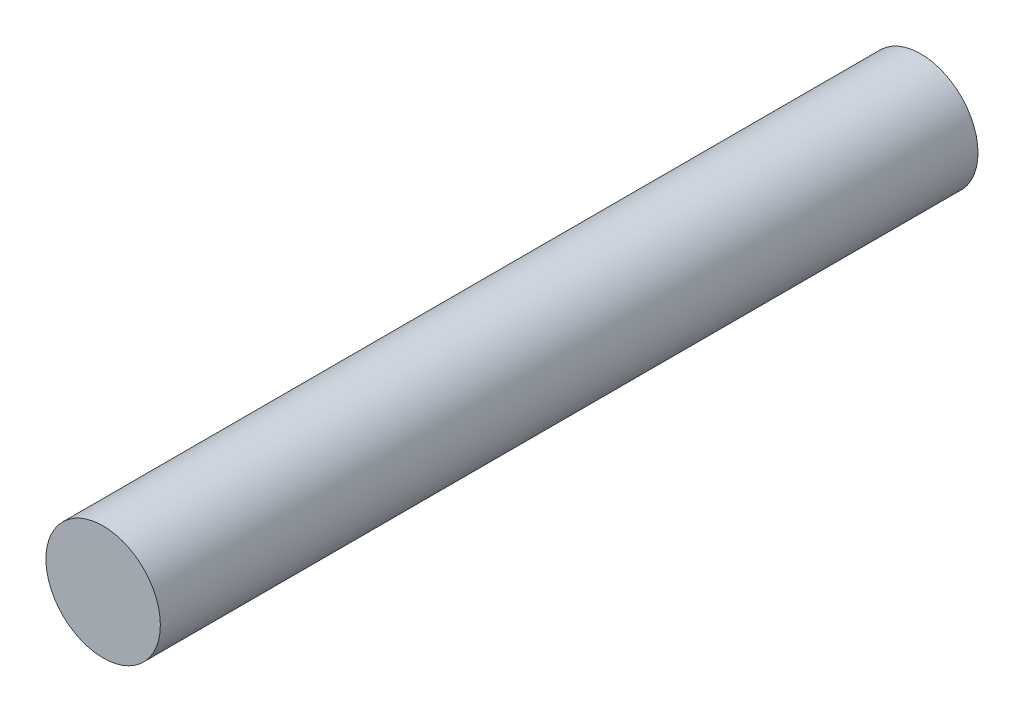
ISO-10303-21;
HEADER;
FILE_DESCRIPTION(('STEP AP214'),'2;1');
FILE_NAME('part.step','',(''),(''),'','','');
FILE_SCHEMA(('AUTOMOTIVE_DESIGN { 1 0 10303 214 1 1 1 1 }'));
ENDSEC;
DATA;
#1=APPLICATION_CONTEXT('core data for automotive mechanical design processes');
#2=APPLICATION_PROTOCOL_DEFINITION('international standard','automotive_design',2000,#1);
#3=PRODUCT_CONTEXT('',#1,'mechanical');
#4=PRODUCT('Part','Part','',(#3));
#5=PRODUCT_RELATED_PRODUCT_CATEGORY('part','',(#4));
#6=PRODUCT_DEFINITION_FORMATION('','',#4);
#7=PRODUCT_DEFINITION_CONTEXT('part definition',#1,'design');
#8=PRODUCT_DEFINITION('design','',#6,#7);
#9=PRODUCT_DEFINITION_SHAPE('','',#8);
#10=(LENGTH_UNIT() NAMED_UNIT(*) SI_UNIT(.MILLI.,.METRE.));
#11=(NAMED_UNIT(*) PLANE_ANGLE_UNIT() SI_UNIT($,.RADIAN.));
#12=(NAMED_UNIT(*) SI_UNIT($,.STERADIAN.) SOLID_ANGLE_UNIT());
#13=UNCERTAINTY_MEASURE_WITH_UNIT(LENGTH_MEASURE(1.E-05),#10,'distance_accuracy_value','');
#14=(GEOMETRIC_REPRESENTATION_CONTEXT(3) GLOBAL_UNCERTAINTY_ASSIGNED_CONTEXT((#13)) GLOBAL_UNIT_ASSIGNED_CONTEXT((#10,
#11,#12)) REPRESENTATION_CONTEXT('',''));
#15=CARTESIAN_POINT('',(0.,0.,0.));
#16=DIRECTION('',(0.,0.,1.));
#17=DIRECTION('',(1.,0.,0.));
#18=AXIS2_PLACEMENT_3D('',#15,#16,#17);
#19=CARTESIAN_POINT('',(0.,0.,100.));
#20=DIRECTION('',(0.,0.,-1.));
#21=DIRECTION('',(-1.,0.,0.));
#22=AXIS2_PLACEMENT_3D('',#19,#20,#21);
#23=CYLINDRICAL_SURFACE('',#22,7.);
#24=CARTESIAN_POINT('',(0.,0.,100.));
#25=DIRECTION('',(0.,0.,1.));
#26=DIRECTION('',(1.,0.,0.));
#27=AXIS2_PLACEMENT_3D('',#24,#25,#26);
#28=CIRCLE('',#27,7.);
#29=CARTESIAN_POINT('',(7.,0.,100.));
#30=VERTEX_POINT('',#29);
#31=EDGE_CURVE('E10',#30,#30,#28,.T.);
#32=ORIENTED_EDGE('',*,*,#31,.F.);
#33=EDGE_LOOP('',(#32));
#34=FACE_BOUND('',#33,.T.);
#35=CARTESIAN_POINT('',(0.,0.,0.));
#36=DIRECTION('',(0.,0.,1.));
#37=DIRECTION('',(1.,0.,0.));
#38=AXIS2_PLACEMENT_3D('',#35,#36,#37);
#39=CIRCLE('',#38,7.);
#40=CARTESIAN_POINT('',(7.,0.,0.));
#41=VERTEX_POINT('',#40);
#42=EDGE_CURVE('E40',#41,#41,#39,.T.);
#43=ORIENTED_EDGE('',*,*,#42,.T.);
#44=EDGE_LOOP('',(#43));
#45=FACE_BOUND('',#44,.T.);
#46=ADVANCED_FACE('F37',(#34,#45),#23,.T.);
#47=CARTESIAN_POINT('',(0.,0.,100.));
#48=DIRECTION('',(0.,0.,1.));
#49=DIRECTION('',(1.,0.,0.));
#50=AXIS2_PLACEMENT_3D('',#47,#48,#49);
#51=PLANE('',#50);
#52=ORIENTED_EDGE('',*,*,#31,.T.);
#53=EDGE_LOOP('',(#52));
#54=FACE_BOUND('',#53,.T.);
#55=ADVANCED_FACE('F54',(#54),#51,.T.);
#56=CARTESIAN_POINT('',(0.,0.,0.));
#57=DIRECTION('',(0.,0.,1.));
#58=DIRECTION('',(1.,0.,0.));
#59=AXIS2_PLACEMENT_3D('',#56,#57,#58);
#60=PLANE('',#59);
#61=ORIENTED_EDGE('',*,*,#42,.F.);
#62=EDGE_LOOP('',(#61));
#63=FACE_BOUND('',#62,.T.);
#64=ADVANCED_FACE('F52',(#63),#60,.F.);
#65=CLOSED_SHELL('',(#46,#55,#64));
#66=MANIFOLD_SOLID_BREP('B2',#65);
#67=ADVANCED_BREP_SHAPE_REPRESENTATION('',(#18,#66),#14);
#68=SHAPE_DEFINITION_REPRESENTATION(#9,#67);
ENDSEC;
END-ISO-10303-21;
